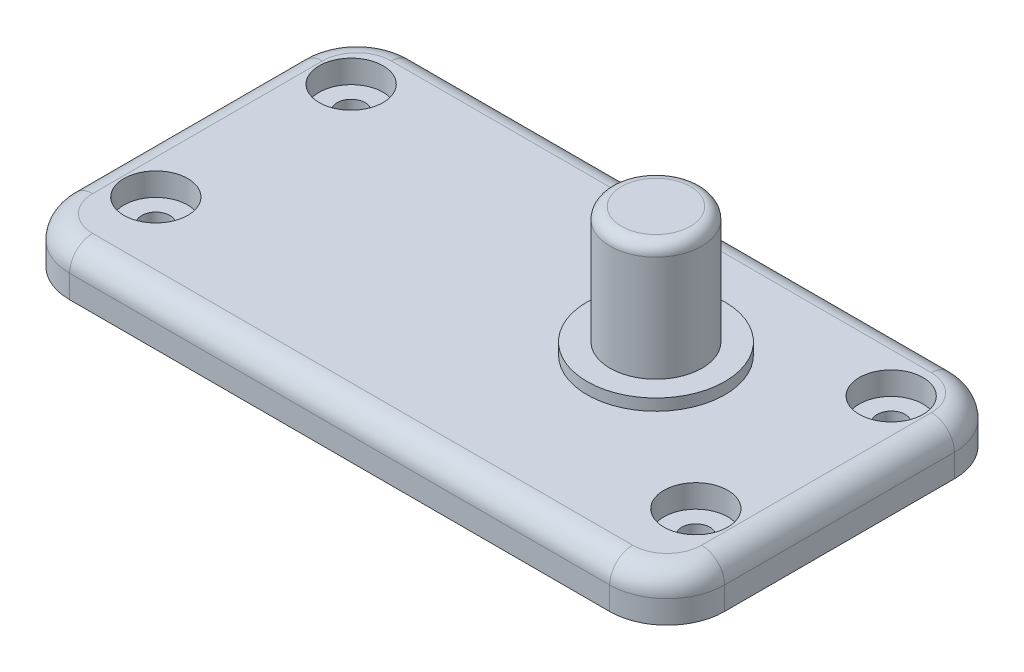
ISO-10303-21;
HEADER;
FILE_DESCRIPTION(('STEP AP214'),'2;1');
FILE_NAME('part.step','',(''),(''),'','','');
FILE_SCHEMA(('AUTOMOTIVE_DESIGN { 1 0 10303 214 1 1 1 1 }'));
ENDSEC;
DATA;
#1=APPLICATION_CONTEXT('core data for automotive mechanical design processes');
#2=APPLICATION_PROTOCOL_DEFINITION('international standard','automotive_design',2000,#1);
#3=PRODUCT_CONTEXT('',#1,'mechanical');
#4=PRODUCT('Part','Part','',(#3));
#5=PRODUCT_RELATED_PRODUCT_CATEGORY('part','',(#4));
#6=PRODUCT_DEFINITION_FORMATION('','',#4);
#7=PRODUCT_DEFINITION_CONTEXT('part definition',#1,'design');
#8=PRODUCT_DEFINITION('design','',#6,#7);
#9=PRODUCT_DEFINITION_SHAPE('','',#8);
#10=(LENGTH_UNIT() NAMED_UNIT(*) SI_UNIT(.MILLI.,.METRE.));
#11=(NAMED_UNIT(*) PLANE_ANGLE_UNIT() SI_UNIT($,.RADIAN.));
#12=(NAMED_UNIT(*) SI_UNIT($,.STERADIAN.) SOLID_ANGLE_UNIT());
#13=UNCERTAINTY_MEASURE_WITH_UNIT(LENGTH_MEASURE(1.E-05),#10,'distance_accuracy_value','');
#14=(GEOMETRIC_REPRESENTATION_CONTEXT(3) GLOBAL_UNCERTAINTY_ASSIGNED_CONTEXT((#13)) GLOBAL_UNIT_ASSIGNED_CONTEXT((#10,
#11,#12)) REPRESENTATION_CONTEXT('',''));
#15=CARTESIAN_POINT('',(0.,0.,0.));
#16=DIRECTION('',(0.,0.,1.));
#17=DIRECTION('',(1.,0.,0.));
#18=AXIS2_PLACEMENT_3D('',#15,#16,#17);
#19=CARTESIAN_POINT('',(-28.5,4.,15.));
#20=DIRECTION('',(1.,0.,0.));
#21=DIRECTION('',(0.,0.,-1.));
#22=AXIS2_PLACEMENT_3D('',#19,#20,#21);
#23=PLANE('',#22);
#24=DIRECTION('',(0.,-1.,0.));
#25=VECTOR('',#24,1.);
#26=CARTESIAN_POINT('',(-28.5,4.,10.));
#27=LINE('',#26,#25);
#28=CARTESIAN_POINT('',(-28.5,0.,10.));
#29=VERTEX_POINT('',#28);
#30=CARTESIAN_POINT('',(-28.5,2.,10.));
#31=VERTEX_POINT('',#30);
#32=EDGE_CURVE('E142',#29,#31,#27,.F.);
#33=ORIENTED_EDGE('',*,*,#32,.T.);
#34=DIRECTION('',(0.,0.,1.));
#35=VECTOR('',#34,1.);
#36=CARTESIAN_POINT('',(-28.5,2.,15.));
#37=LINE('',#36,#35);
#38=CARTESIAN_POINT('',(-28.5,2.,-10.));
#39=VERTEX_POINT('',#38);
#40=EDGE_CURVE('E205',#31,#39,#37,.F.);
#41=ORIENTED_EDGE('',*,*,#40,.T.);
#42=DIRECTION('',(0.,-1.,0.));
#43=VECTOR('',#42,1.);
#44=CARTESIAN_POINT('',(-28.5,4.,-10.));
#45=LINE('',#44,#43);
#46=CARTESIAN_POINT('',(-28.5,0.,-10.));
#47=VERTEX_POINT('',#46);
#48=EDGE_CURVE('E146',#39,#47,#45,.T.);
#49=ORIENTED_EDGE('',*,*,#48,.T.);
#50=DIRECTION('',(0.,0.,1.));
#51=VECTOR('',#50,1.);
#52=CARTESIAN_POINT('',(-28.5,0.,15.));
#53=LINE('',#52,#51);
#54=EDGE_CURVE('E153',#47,#29,#53,.T.);
#55=ORIENTED_EDGE('',*,*,#54,.T.);
#56=EDGE_LOOP('',(#33,#41,#49,#55));
#57=FACE_BOUND('',#56,.T.);
#58=ADVANCED_FACE('F34',(#57),#23,.F.);
#59=CARTESIAN_POINT('',(-28.5,4.,15.));
#60=DIRECTION('',(0.,0.,-1.));
#61=DIRECTION('',(-1.,0.,0.));
#62=AXIS2_PLACEMENT_3D('',#59,#60,#61);
#63=PLANE('',#62);
#64=DIRECTION('',(0.,-1.,0.));
#65=VECTOR('',#64,1.);
#66=CARTESIAN_POINT('',(23.5,4.,15.));
#67=LINE('',#66,#65);
#68=CARTESIAN_POINT('',(23.5,0.,15.));
#69=VERTEX_POINT('',#68);
#70=CARTESIAN_POINT('',(23.5,2.,15.));
#71=VERTEX_POINT('',#70);
#72=EDGE_CURVE('E136',#69,#71,#67,.F.);
#73=ORIENTED_EDGE('',*,*,#72,.T.);
#74=DIRECTION('',(1.,0.,0.));
#75=VECTOR('',#74,1.);
#76=CARTESIAN_POINT('',(-28.5,2.,15.));
#77=LINE('',#76,#75);
#78=CARTESIAN_POINT('',(-23.5,2.,15.));
#79=VERTEX_POINT('',#78);
#80=EDGE_CURVE('E131',#71,#79,#77,.F.);
#81=ORIENTED_EDGE('',*,*,#80,.T.);
#82=DIRECTION('',(0.,-1.,0.));
#83=VECTOR('',#82,1.);
#84=CARTESIAN_POINT('',(-23.5,4.,15.));
#85=LINE('',#84,#83);
#86=CARTESIAN_POINT('',(-23.5,0.,15.));
#87=VERTEX_POINT('',#86);
#88=EDGE_CURVE('E125',#79,#87,#85,.T.);
#89=ORIENTED_EDGE('',*,*,#88,.T.);
#90=DIRECTION('',(1.,0.,0.));
#91=VECTOR('',#90,1.);
#92=CARTESIAN_POINT('',(-28.5,0.,15.));
#93=LINE('',#92,#91);
#94=EDGE_CURVE('E129',#87,#69,#93,.T.);
#95=ORIENTED_EDGE('',*,*,#94,.T.);
#96=EDGE_LOOP('',(#73,#81,#89,#95));
#97=FACE_BOUND('',#96,.T.);
#98=ADVANCED_FACE('F127',(#97),#63,.F.);
#99=CARTESIAN_POINT('',(28.5,4.,15.));
#100=DIRECTION('',(-1.,0.,0.));
#101=DIRECTION('',(0.,0.,1.));
#102=AXIS2_PLACEMENT_3D('',#99,#100,#101);
#103=PLANE('',#102);
#104=DIRECTION('',(0.,-1.,0.));
#105=VECTOR('',#104,1.);
#106=CARTESIAN_POINT('',(28.5,4.,-10.));
#107=LINE('',#106,#105);
#108=CARTESIAN_POINT('',(28.5,0.,-10.));
#109=VERTEX_POINT('',#108);
#110=CARTESIAN_POINT('',(28.5,2.,-10.));
#111=VERTEX_POINT('',#110);
#112=EDGE_CURVE('E184',#109,#111,#107,.F.);
#113=ORIENTED_EDGE('',*,*,#112,.T.);
#114=DIRECTION('',(0.,0.,-1.));
#115=VECTOR('',#114,1.);
#116=CARTESIAN_POINT('',(28.5,2.,15.));
#117=LINE('',#116,#115);
#118=CARTESIAN_POINT('',(28.5,2.,10.));
#119=VERTEX_POINT('',#118);
#120=EDGE_CURVE('E57',#111,#119,#117,.F.);
#121=ORIENTED_EDGE('',*,*,#120,.T.);
#122=DIRECTION('',(0.,-1.,0.));
#123=VECTOR('',#122,1.);
#124=CARTESIAN_POINT('',(28.5,4.,10.));
#125=LINE('',#124,#123);
#126=CARTESIAN_POINT('',(28.5,0.,10.));
#127=VERTEX_POINT('',#126);
#128=EDGE_CURVE('E182',#119,#127,#125,.T.);
#129=ORIENTED_EDGE('',*,*,#128,.T.);
#130=DIRECTION('',(0.,0.,-1.));
#131=VECTOR('',#130,1.);
#132=CARTESIAN_POINT('',(28.5,0.,15.));
#133=LINE('',#132,#131);
#134=EDGE_CURVE('E152',#127,#109,#133,.T.);
#135=ORIENTED_EDGE('',*,*,#134,.T.);
#136=EDGE_LOOP('',(#113,#121,#129,#135));
#137=FACE_BOUND('',#136,.T.);
#138=ADVANCED_FACE('F259',(#137),#103,.F.);
#139=CARTESIAN_POINT('',(-28.5,4.,-15.));
#140=DIRECTION('',(0.,0.,1.));
#141=DIRECTION('',(1.,0.,0.));
#142=AXIS2_PLACEMENT_3D('',#139,#140,#141);
#143=PLANE('',#142);
#144=DIRECTION('',(0.,-1.,0.));
#145=VECTOR('',#144,1.);
#146=CARTESIAN_POINT('',(-23.5,4.,-15.));
#147=LINE('',#146,#145);
#148=CARTESIAN_POINT('',(-23.5,0.,-15.));
#149=VERTEX_POINT('',#148);
#150=CARTESIAN_POINT('',(-23.5,2.,-15.));
#151=VERTEX_POINT('',#150);
#152=EDGE_CURVE('E179',#149,#151,#147,.F.);
#153=ORIENTED_EDGE('',*,*,#152,.T.);
#154=DIRECTION('',(-1.,0.,0.));
#155=VECTOR('',#154,1.);
#156=CARTESIAN_POINT('',(-28.5,2.,-15.));
#157=LINE('',#156,#155);
#158=CARTESIAN_POINT('',(23.5,2.,-15.));
#159=VERTEX_POINT('',#158);
#160=EDGE_CURVE('E209',#151,#159,#157,.F.);
#161=ORIENTED_EDGE('',*,*,#160,.T.);
#162=DIRECTION('',(0.,-1.,0.));
#163=VECTOR('',#162,1.);
#164=CARTESIAN_POINT('',(23.5,4.,-15.));
#165=LINE('',#164,#163);
#166=CARTESIAN_POINT('',(23.5,0.,-15.));
#167=VERTEX_POINT('',#166);
#168=EDGE_CURVE('E177',#159,#167,#165,.T.);
#169=ORIENTED_EDGE('',*,*,#168,.T.);
#170=DIRECTION('',(-1.,0.,0.));
#171=VECTOR('',#170,1.);
#172=CARTESIAN_POINT('',(-28.5,0.,-15.));
#173=LINE('',#172,#171);
#174=EDGE_CURVE('E156',#167,#149,#173,.T.);
#175=ORIENTED_EDGE('',*,*,#174,.T.);
#176=EDGE_LOOP('',(#153,#161,#169,#175));
#177=FACE_BOUND('',#176,.T.);
#178=ADVANCED_FACE('F322',(#177),#143,.F.);
#179=CARTESIAN_POINT('',(0.,4.,0.));
#180=DIRECTION('',(0.,-1.,0.));
#181=DIRECTION('',(0.,0.,-1.));
#182=AXIS2_PLACEMENT_3D('',#179,#180,#181);
#183=PLANE('',#182);
#184=DIRECTION('',(0.,0.,1.));
#185=VECTOR('',#184,1.);
#186=CARTESIAN_POINT('',(-26.5,4.,0.));
#187=LINE('',#186,#185);
#188=CARTESIAN_POINT('',(-26.5,4.,-10.));
#189=VERTEX_POINT('',#188);
#190=CARTESIAN_POINT('',(-26.5,4.,10.));
#191=VERTEX_POINT('',#190);
#192=EDGE_CURVE('E198',#189,#191,#187,.T.);
#193=ORIENTED_EDGE('',*,*,#192,.T.);
#194=CARTESIAN_POINT('',(-23.5,4.,10.));
#195=DIRECTION('',(0.,-1.,0.));
#196=DIRECTION('',(0.,0.,-1.));
#197=AXIS2_PLACEMENT_3D('',#194,#195,#196);
#198=CIRCLE('',#197,3.);
#199=CARTESIAN_POINT('',(-23.5,4.,13.));
#200=VERTEX_POINT('',#199);
#201=EDGE_CURVE('E200',#191,#200,#198,.F.);
#202=ORIENTED_EDGE('',*,*,#201,.T.);
#203=DIRECTION('',(1.,0.,0.));
#204=VECTOR('',#203,1.);
#205=CARTESIAN_POINT('',(0.,4.,13.));
#206=LINE('',#205,#204);
#207=CARTESIAN_POINT('',(23.5,4.,13.));
#208=VERTEX_POINT('',#207);
#209=EDGE_CURVE('E186',#200,#208,#206,.T.);
#210=ORIENTED_EDGE('',*,*,#209,.T.);
#211=CARTESIAN_POINT('',(23.5,4.,10.));
#212=DIRECTION('',(0.,-1.,0.));
#213=DIRECTION('',(0.,0.,-1.));
#214=AXIS2_PLACEMENT_3D('',#211,#212,#213);
#215=CIRCLE('',#214,3.);
#216=CARTESIAN_POINT('',(26.5,4.,10.));
#217=VERTEX_POINT('',#216);
#218=EDGE_CURVE('E188',#208,#217,#215,.F.);
#219=ORIENTED_EDGE('',*,*,#218,.T.);
#220=DIRECTION('',(0.,0.,-1.));
#221=VECTOR('',#220,1.);
#222=CARTESIAN_POINT('',(26.5,4.,0.));
#223=LINE('',#222,#221);
#224=CARTESIAN_POINT('',(26.5,4.,-10.));
#225=VERTEX_POINT('',#224);
#226=EDGE_CURVE('E190',#217,#225,#223,.T.);
#227=ORIENTED_EDGE('',*,*,#226,.T.);
#228=CARTESIAN_POINT('',(23.5,4.,-10.));
#229=DIRECTION('',(0.,-1.,0.));
#230=DIRECTION('',(0.,0.,-1.));
#231=AXIS2_PLACEMENT_3D('',#228,#229,#230);
#232=CIRCLE('',#231,3.);
#233=CARTESIAN_POINT('',(23.5,4.,-13.));
#234=VERTEX_POINT('',#233);
#235=EDGE_CURVE('E192',#225,#234,#232,.F.);
#236=ORIENTED_EDGE('',*,*,#235,.T.);
#237=DIRECTION('',(-1.,0.,0.));
#238=VECTOR('',#237,1.);
#239=CARTESIAN_POINT('',(0.,4.,-13.));
#240=LINE('',#239,#238);
#241=CARTESIAN_POINT('',(-23.5,4.,-13.));
#242=VERTEX_POINT('',#241);
#243=EDGE_CURVE('E194',#234,#242,#240,.T.);
#244=ORIENTED_EDGE('',*,*,#243,.T.);
#245=CARTESIAN_POINT('',(-23.5,4.,-10.));
#246=DIRECTION('',(0.,-1.,0.));
#247=DIRECTION('',(0.,0.,-1.));
#248=AXIS2_PLACEMENT_3D('',#245,#246,#247);
#249=CIRCLE('',#248,3.);
#250=EDGE_CURVE('E196',#242,#189,#249,.F.);
#251=ORIENTED_EDGE('',*,*,#250,.T.);
#252=EDGE_LOOP('',(#193,#202,#210,#219,#227,#236,#244,#251));
#253=FACE_BOUND('',#252,.T.);
#254=CARTESIAN_POINT('',(-23.5,4.,-9.49999999999999));
#255=DIRECTION('',(0.,1.,0.));
#256=DIRECTION('',(0.,0.,1.));
#257=AXIS2_PLACEMENT_3D('',#254,#255,#256);
#258=CIRCLE('',#257,2.77875999999999);
#259=CARTESIAN_POINT('',(-23.5,4.,-6.72124));
#260=VERTEX_POINT('',#259);
#261=EDGE_CURVE('E237',#260,#260,#258,.T.);
#262=ORIENTED_EDGE('',*,*,#261,.F.);
#263=EDGE_LOOP('',(#262));
#264=FACE_BOUND('',#263,.T.);
#265=CARTESIAN_POINT('',(-23.5,4.,7.50000000000001));
#266=DIRECTION('',(0.,1.,0.));
#267=DIRECTION('',(0.,0.,1.));
#268=AXIS2_PLACEMENT_3D('',#265,#266,#267);
#269=CIRCLE('',#268,2.77875999999999);
#270=CARTESIAN_POINT('',(-23.5,4.,10.27876));
#271=VERTEX_POINT('',#270);
#272=EDGE_CURVE('E424',#271,#271,#269,.T.);
#273=ORIENTED_EDGE('',*,*,#272,.F.);
#274=EDGE_LOOP('',(#273));
#275=FACE_BOUND('',#274,.T.);
#276=CARTESIAN_POINT('',(23.5,4.,7.50000000000001));
#277=DIRECTION('',(0.,1.,0.));
#278=DIRECTION('',(0.,0.,1.));
#279=AXIS2_PLACEMENT_3D('',#276,#277,#278);
#280=CIRCLE('',#279,2.77875999999999);
#281=CARTESIAN_POINT('',(23.5,4.,10.27876));
#282=VERTEX_POINT('',#281);
#283=EDGE_CURVE('E436',#282,#282,#280,.T.);
#284=ORIENTED_EDGE('',*,*,#283,.F.);
#285=EDGE_LOOP('',(#284));
#286=FACE_BOUND('',#285,.T.);
#287=CARTESIAN_POINT('',(23.5,4.,-9.49999999999999));
#288=DIRECTION('',(0.,1.,0.));
#289=DIRECTION('',(0.,0.,1.));
#290=AXIS2_PLACEMENT_3D('',#287,#288,#289);
#291=CIRCLE('',#290,2.77875999999999);
#292=CARTESIAN_POINT('',(23.5,4.,-6.72124));
#293=VERTEX_POINT('',#292);
#294=EDGE_CURVE('E448',#293,#293,#291,.T.);
#295=ORIENTED_EDGE('',*,*,#294,.F.);
#296=EDGE_LOOP('',(#295));
#297=FACE_BOUND('',#296,.T.);
#298=CARTESIAN_POINT('',(10.18,4.,-2.35));
#299=DIRECTION('',(0.,-1.,0.));
#300=DIRECTION('',(0.,0.,-1.));
#301=AXIS2_PLACEMENT_3D('',#298,#299,#300);
#302=CIRCLE('',#301,5.99999999999999);
#303=CARTESIAN_POINT('',(10.18,4.,-8.34999999999999));
#304=VERTEX_POINT('',#303);
#305=EDGE_CURVE('E164',#304,#304,#302,.F.);
#306=ORIENTED_EDGE('',*,*,#305,.F.);
#307=EDGE_LOOP('',(#306));
#308=FACE_BOUND('',#307,.T.);
#309=ADVANCED_FACE('F332',(#253,#264,#275,#286,#297,#308),#183,.F.);
#310=CARTESIAN_POINT('',(0.,0.,0.));
#311=DIRECTION('',(0.,-1.,0.));
#312=DIRECTION('',(0.,0.,-1.));
#313=AXIS2_PLACEMENT_3D('',#310,#311,#312);
#314=PLANE('',#313);
#315=CARTESIAN_POINT('',(-23.5,0.,-9.49999999999999));
#316=DIRECTION('',(0.,1.,0.));
#317=DIRECTION('',(0.,0.,1.));
#318=AXIS2_PLACEMENT_3D('',#315,#316,#317);
#319=CIRCLE('',#318,1.2192);
#320=CARTESIAN_POINT('',(-23.5,0.,-8.28079999999999));
#321=VERTEX_POINT('',#320);
#322=EDGE_CURVE('E421',#321,#321,#319,.T.);
#323=ORIENTED_EDGE('',*,*,#322,.T.);
#324=EDGE_LOOP('',(#323));
#325=FACE_BOUND('',#324,.T.);
#326=CARTESIAN_POINT('',(-23.5,0.,7.50000000000001));
#327=DIRECTION('',(0.,1.,0.));
#328=DIRECTION('',(0.,0.,1.));
#329=AXIS2_PLACEMENT_3D('',#326,#327,#328);
#330=CIRCLE('',#329,1.2192);
#331=CARTESIAN_POINT('',(-23.5,0.,8.71920000000001));
#332=VERTEX_POINT('',#331);
#333=EDGE_CURVE('E433',#332,#332,#330,.T.);
#334=ORIENTED_EDGE('',*,*,#333,.T.);
#335=EDGE_LOOP('',(#334));
#336=FACE_BOUND('',#335,.T.);
#337=CARTESIAN_POINT('',(23.5,0.,7.50000000000001));
#338=DIRECTION('',(0.,1.,0.));
#339=DIRECTION('',(0.,0.,1.));
#340=AXIS2_PLACEMENT_3D('',#337,#338,#339);
#341=CIRCLE('',#340,1.2192);
#342=CARTESIAN_POINT('',(23.5,0.,8.71920000000001));
#343=VERTEX_POINT('',#342);
#344=EDGE_CURVE('E445',#343,#343,#341,.T.);
#345=ORIENTED_EDGE('',*,*,#344,.T.);
#346=EDGE_LOOP('',(#345));
#347=FACE_BOUND('',#346,.T.);
#348=CARTESIAN_POINT('',(23.5,0.,-9.49999999999999));
#349=DIRECTION('',(0.,1.,0.));
#350=DIRECTION('',(0.,0.,1.));
#351=AXIS2_PLACEMENT_3D('',#348,#349,#350);
#352=CIRCLE('',#351,1.2192);
#353=CARTESIAN_POINT('',(23.5,0.,-8.28079999999999));
#354=VERTEX_POINT('',#353);
#355=EDGE_CURVE('E457',#354,#354,#352,.T.);
#356=ORIENTED_EDGE('',*,*,#355,.T.);
#357=EDGE_LOOP('',(#356));
#358=FACE_BOUND('',#357,.T.);
#359=ORIENTED_EDGE('',*,*,#94,.F.);
#360=CARTESIAN_POINT('',(-23.5,0.,10.));
#361=DIRECTION('',(0.,-1.,0.));
#362=DIRECTION('',(0.,0.,-1.));
#363=AXIS2_PLACEMENT_3D('',#360,#361,#362);
#364=CIRCLE('',#363,5.);
#365=EDGE_CURVE('E139',#87,#29,#364,.T.);
#366=ORIENTED_EDGE('',*,*,#365,.T.);
#367=ORIENTED_EDGE('',*,*,#54,.F.);
#368=CARTESIAN_POINT('',(-23.5,0.,-10.));
#369=DIRECTION('',(0.,-1.,0.));
#370=DIRECTION('',(0.,0.,-1.));
#371=AXIS2_PLACEMENT_3D('',#368,#369,#370);
#372=CIRCLE('',#371,5.);
#373=EDGE_CURVE('E147',#47,#149,#372,.T.);
#374=ORIENTED_EDGE('',*,*,#373,.T.);
#375=ORIENTED_EDGE('',*,*,#174,.F.);
#376=CARTESIAN_POINT('',(23.5,0.,-10.));
#377=DIRECTION('',(0.,-1.,0.));
#378=DIRECTION('',(0.,0.,-1.));
#379=AXIS2_PLACEMENT_3D('',#376,#377,#378);
#380=CIRCLE('',#379,5.);
#381=EDGE_CURVE('E172',#167,#109,#380,.T.);
#382=ORIENTED_EDGE('',*,*,#381,.T.);
#383=ORIENTED_EDGE('',*,*,#134,.F.);
#384=CARTESIAN_POINT('',(23.5,0.,10.));
#385=DIRECTION('',(0.,-1.,0.));
#386=DIRECTION('',(0.,0.,-1.));
#387=AXIS2_PLACEMENT_3D('',#384,#385,#386);
#388=CIRCLE('',#387,5.);
#389=EDGE_CURVE('E135',#127,#69,#388,.T.);
#390=ORIENTED_EDGE('',*,*,#389,.T.);
#391=EDGE_LOOP('',(#359,#366,#367,#374,#375,#382,#383,#390));
#392=FACE_BOUND('',#391,.T.);
#393=ADVANCED_FACE('F149',(#325,#336,#347,#358,#392),#314,.T.);
#394=CARTESIAN_POINT('',(10.18,5.,-2.35));
#395=DIRECTION('',(0.,-1.,0.));
#396=DIRECTION('',(0.,0.,-1.));
#397=AXIS2_PLACEMENT_3D('',#394,#395,#396);
#398=CYLINDRICAL_SURFACE('',#397,5.99999999999999);
#399=CARTESIAN_POINT('',(10.18,5.,-2.35));
#400=DIRECTION('',(0.,1.,0.));
#401=DIRECTION('',(0.,0.,1.));
#402=AXIS2_PLACEMENT_3D('',#399,#400,#401);
#403=CIRCLE('',#402,5.99999999999999);
#404=CARTESIAN_POINT('',(10.18,5.,3.65));
#405=VERTEX_POINT('',#404);
#406=EDGE_CURVE('E167',#405,#405,#403,.T.);
#407=ORIENTED_EDGE('',*,*,#406,.F.);
#408=EDGE_LOOP('',(#407));
#409=FACE_BOUND('',#408,.T.);
#410=ORIENTED_EDGE('',*,*,#305,.T.);
#411=EDGE_LOOP('',(#410));
#412=FACE_BOUND('',#411,.T.);
#413=ADVANCED_FACE('F344',(#409,#412),#398,.T.);
#414=CARTESIAN_POINT('',(10.18,5.,-2.35));
#415=DIRECTION('',(0.,1.,0.));
#416=DIRECTION('',(0.,0.,1.));
#417=AXIS2_PLACEMENT_3D('',#414,#415,#416);
#418=PLANE('',#417);
#419=CARTESIAN_POINT('',(10.18,5.,-2.35));
#420=DIRECTION('',(0.,1.,0.));
#421=DIRECTION('',(0.,0.,1.));
#422=AXIS2_PLACEMENT_3D('',#419,#420,#421);
#423=CIRCLE('',#422,3.99999999999999);
#424=CARTESIAN_POINT('',(10.18,5.,1.64999999999999));
#425=VERTEX_POINT('',#424);
#426=EDGE_CURVE('E158',#425,#425,#423,.T.);
#427=ORIENTED_EDGE('',*,*,#426,.F.);
#428=EDGE_LOOP('',(#427));
#429=FACE_BOUND('',#428,.T.);
#430=ORIENTED_EDGE('',*,*,#406,.T.);
#431=EDGE_LOOP('',(#430));
#432=FACE_BOUND('',#431,.T.);
#433=ADVANCED_FACE('F355',(#429,#432),#418,.T.);
#434=CARTESIAN_POINT('',(10.18,15.2,-2.35));
#435=DIRECTION('',(0.,1.,0.));
#436=DIRECTION('',(0.,0.,1.));
#437=AXIS2_PLACEMENT_3D('',#434,#435,#436);
#438=PLANE('',#437);
#439=CARTESIAN_POINT('',(10.18,15.2,-2.35));
#440=DIRECTION('',(0.,1.,0.));
#441=DIRECTION('',(0.,0.,1.));
#442=AXIS2_PLACEMENT_3D('',#439,#440,#441);
#443=CIRCLE('',#442,2.99999999999999);
#444=CARTESIAN_POINT('',(10.18,15.2,0.649999999999995));
#445=VERTEX_POINT('',#444);
#446=EDGE_CURVE('E42',#445,#445,#443,.T.);
#447=ORIENTED_EDGE('',*,*,#446,.T.);
#448=EDGE_LOOP('',(#447));
#449=FACE_BOUND('',#448,.T.);
#450=ADVANCED_FACE('F241',(#449),#438,.T.);
#451=CARTESIAN_POINT('',(10.18,15.2,-2.35));
#452=DIRECTION('',(0.,-1.,0.));
#453=DIRECTION('',(0.,0.,-1.));
#454=AXIS2_PLACEMENT_3D('',#451,#452,#453);
#455=CYLINDRICAL_SURFACE('',#454,3.99999999999999);
#456=CARTESIAN_POINT('',(10.18,14.2,-2.35));
#457=DIRECTION('',(0.,1.,0.));
#458=DIRECTION('',(0.,0.,1.));
#459=AXIS2_PLACEMENT_3D('',#456,#457,#458);
#460=CIRCLE('',#459,3.99999999999999);
#461=CARTESIAN_POINT('',(10.18,14.2,1.64999999999999));
#462=VERTEX_POINT('',#461);
#463=EDGE_CURVE('E11',#462,#462,#460,.F.);
#464=ORIENTED_EDGE('',*,*,#463,.T.);
#465=EDGE_LOOP('',(#464));
#466=FACE_BOUND('',#465,.T.);
#467=ORIENTED_EDGE('',*,*,#426,.T.);
#468=EDGE_LOOP('',(#467));
#469=FACE_BOUND('',#468,.T.);
#470=ADVANCED_FACE('F348',(#466,#469),#455,.T.);
#471=CARTESIAN_POINT('',(23.5,4.,-9.49999999999999));
#472=DIRECTION('',(0.,1.,0.));
#473=DIRECTION('',(0.,0.,1.));
#474=AXIS2_PLACEMENT_3D('',#471,#472,#473);
#475=CYLINDRICAL_SURFACE('',#474,1.2192);
#476=ORIENTED_EDGE('',*,*,#355,.F.);
#477=EDGE_LOOP('',(#476));
#478=FACE_BOUND('',#477,.T.);
#479=CARTESIAN_POINT('',(23.5,1.999999936,-9.49999999999999));
#480=DIRECTION('',(0.,1.,0.));
#481=DIRECTION('',(0.,0.,1.));
#482=AXIS2_PLACEMENT_3D('',#479,#480,#481);
#483=CIRCLE('',#482,1.2192);
#484=CARTESIAN_POINT('',(23.5,1.999999936,-8.28079999999999));
#485=VERTEX_POINT('',#484);
#486=EDGE_CURVE('E454',#485,#485,#483,.T.);
#487=ORIENTED_EDGE('',*,*,#486,.T.);
#488=EDGE_LOOP('',(#487));
#489=FACE_BOUND('',#488,.T.);
#490=ADVANCED_FACE('F351',(#478,#489),#475,.F.);
#491=CARTESIAN_POINT('',(24.7192,1.999999936,-9.49999999999999));
#492=DIRECTION('',(0.,-1.,0.));
#493=DIRECTION('',(0.,0.,-1.));
#494=AXIS2_PLACEMENT_3D('',#491,#492,#493);
#495=PLANE('',#494);
#496=ORIENTED_EDGE('',*,*,#486,.F.);
#497=EDGE_LOOP('',(#496));
#498=FACE_BOUND('',#497,.T.);
#499=CARTESIAN_POINT('',(23.5,1.999999936,-9.49999999999999));
#500=DIRECTION('',(0.,1.,0.));
#501=DIRECTION('',(0.,0.,1.));
#502=AXIS2_PLACEMENT_3D('',#499,#500,#501);
#503=CIRCLE('',#502,2.77876);
#504=CARTESIAN_POINT('',(23.5,1.999999936,-6.72124));
#505=VERTEX_POINT('',#504);
#506=EDGE_CURVE('E451',#505,#505,#503,.T.);
#507=ORIENTED_EDGE('',*,*,#506,.T.);
#508=EDGE_LOOP('',(#507));
#509=FACE_BOUND('',#508,.T.);
#510=ADVANCED_FACE('F364',(#498,#509),#495,.F.);
#511=CARTESIAN_POINT('',(23.5,4.,-9.49999999999999));
#512=DIRECTION('',(0.,1.,0.));
#513=DIRECTION('',(0.,0.,1.));
#514=AXIS2_PLACEMENT_3D('',#511,#512,#513);
#515=CYLINDRICAL_SURFACE('',#514,2.77876);
#516=ORIENTED_EDGE('',*,*,#506,.F.);
#517=EDGE_LOOP('',(#516));
#518=FACE_BOUND('',#517,.T.);
#519=ORIENTED_EDGE('',*,*,#294,.T.);
#520=EDGE_LOOP('',(#519));
#521=FACE_BOUND('',#520,.T.);
#522=ADVANCED_FACE('F368',(#518,#521),#515,.F.);
#523=CARTESIAN_POINT('',(23.5,4.,7.50000000000001));
#524=DIRECTION('',(0.,1.,0.));
#525=DIRECTION('',(0.,0.,1.));
#526=AXIS2_PLACEMENT_3D('',#523,#524,#525);
#527=CYLINDRICAL_SURFACE('',#526,1.2192);
#528=ORIENTED_EDGE('',*,*,#344,.F.);
#529=EDGE_LOOP('',(#528));
#530=FACE_BOUND('',#529,.T.);
#531=CARTESIAN_POINT('',(23.5,1.999999936,7.50000000000001));
#532=DIRECTION('',(0.,1.,0.));
#533=DIRECTION('',(0.,0.,1.));
#534=AXIS2_PLACEMENT_3D('',#531,#532,#533);
#535=CIRCLE('',#534,1.2192);
#536=CARTESIAN_POINT('',(23.5,1.999999936,8.71920000000001));
#537=VERTEX_POINT('',#536);
#538=EDGE_CURVE('E442',#537,#537,#535,.T.);
#539=ORIENTED_EDGE('',*,*,#538,.T.);
#540=EDGE_LOOP('',(#539));
#541=FACE_BOUND('',#540,.T.);
#542=ADVANCED_FACE('F372',(#530,#541),#527,.F.);
#543=CARTESIAN_POINT('',(24.7192,1.999999936,7.50000000000001));
#544=DIRECTION('',(0.,-1.,0.));
#545=DIRECTION('',(0.,0.,-1.));
#546=AXIS2_PLACEMENT_3D('',#543,#544,#545);
#547=PLANE('',#546);
#548=ORIENTED_EDGE('',*,*,#538,.F.);
#549=EDGE_LOOP('',(#548));
#550=FACE_BOUND('',#549,.T.);
#551=CARTESIAN_POINT('',(23.5,1.999999936,7.50000000000001));
#552=DIRECTION('',(0.,1.,0.));
#553=DIRECTION('',(0.,0.,1.));
#554=AXIS2_PLACEMENT_3D('',#551,#552,#553);
#555=CIRCLE('',#554,2.77876);
#556=CARTESIAN_POINT('',(23.5,1.999999936,10.27876));
#557=VERTEX_POINT('',#556);
#558=EDGE_CURVE('E439',#557,#557,#555,.T.);
#559=ORIENTED_EDGE('',*,*,#558,.T.);
#560=EDGE_LOOP('',(#559));
#561=FACE_BOUND('',#560,.T.);
#562=ADVANCED_FACE('F376',(#550,#561),#547,.F.);
#563=CARTESIAN_POINT('',(23.5,4.,7.50000000000001));
#564=DIRECTION('',(0.,1.,0.));
#565=DIRECTION('',(0.,0.,1.));
#566=AXIS2_PLACEMENT_3D('',#563,#564,#565);
#567=CYLINDRICAL_SURFACE('',#566,2.77876);
#568=ORIENTED_EDGE('',*,*,#558,.F.);
#569=EDGE_LOOP('',(#568));
#570=FACE_BOUND('',#569,.T.);
#571=ORIENTED_EDGE('',*,*,#283,.T.);
#572=EDGE_LOOP('',(#571));
#573=FACE_BOUND('',#572,.T.);
#574=ADVANCED_FACE('F380',(#570,#573),#567,.F.);
#575=CARTESIAN_POINT('',(-23.5,4.,7.50000000000001));
#576=DIRECTION('',(0.,1.,0.));
#577=DIRECTION('',(0.,0.,1.));
#578=AXIS2_PLACEMENT_3D('',#575,#576,#577);
#579=CYLINDRICAL_SURFACE('',#578,1.2192);
#580=ORIENTED_EDGE('',*,*,#333,.F.);
#581=EDGE_LOOP('',(#580));
#582=FACE_BOUND('',#581,.T.);
#583=CARTESIAN_POINT('',(-23.5,1.999999936,7.50000000000001));
#584=DIRECTION('',(0.,1.,0.));
#585=DIRECTION('',(0.,0.,1.));
#586=AXIS2_PLACEMENT_3D('',#583,#584,#585);
#587=CIRCLE('',#586,1.2192);
#588=CARTESIAN_POINT('',(-23.5,1.999999936,8.71920000000001));
#589=VERTEX_POINT('',#588);
#590=EDGE_CURVE('E430',#589,#589,#587,.T.);
#591=ORIENTED_EDGE('',*,*,#590,.T.);
#592=EDGE_LOOP('',(#591));
#593=FACE_BOUND('',#592,.T.);
#594=ADVANCED_FACE('F384',(#582,#593),#579,.F.);
#595=CARTESIAN_POINT('',(-22.2808,1.999999936,7.50000000000001));
#596=DIRECTION('',(0.,-1.,0.));
#597=DIRECTION('',(0.,0.,-1.));
#598=AXIS2_PLACEMENT_3D('',#595,#596,#597);
#599=PLANE('',#598);
#600=ORIENTED_EDGE('',*,*,#590,.F.);
#601=EDGE_LOOP('',(#600));
#602=FACE_BOUND('',#601,.T.);
#603=CARTESIAN_POINT('',(-23.5,1.999999936,7.50000000000001));
#604=DIRECTION('',(0.,1.,0.));
#605=DIRECTION('',(0.,0.,1.));
#606=AXIS2_PLACEMENT_3D('',#603,#604,#605);
#607=CIRCLE('',#606,2.77876);
#608=CARTESIAN_POINT('',(-23.5,1.999999936,10.27876));
#609=VERTEX_POINT('',#608);
#610=EDGE_CURVE('E427',#609,#609,#607,.T.);
#611=ORIENTED_EDGE('',*,*,#610,.T.);
#612=EDGE_LOOP('',(#611));
#613=FACE_BOUND('',#612,.T.);
#614=ADVANCED_FACE('F388',(#602,#613),#599,.F.);
#615=CARTESIAN_POINT('',(-23.5,4.,7.50000000000001));
#616=DIRECTION('',(0.,1.,0.));
#617=DIRECTION('',(0.,0.,1.));
#618=AXIS2_PLACEMENT_3D('',#615,#616,#617);
#619=CYLINDRICAL_SURFACE('',#618,2.77876);
#620=ORIENTED_EDGE('',*,*,#610,.F.);
#621=EDGE_LOOP('',(#620));
#622=FACE_BOUND('',#621,.T.);
#623=ORIENTED_EDGE('',*,*,#272,.T.);
#624=EDGE_LOOP('',(#623));
#625=FACE_BOUND('',#624,.T.);
#626=ADVANCED_FACE('F392',(#622,#625),#619,.F.);
#627=CARTESIAN_POINT('',(-23.5,4.,-9.49999999999999));
#628=DIRECTION('',(0.,1.,0.));
#629=DIRECTION('',(0.,0.,1.));
#630=AXIS2_PLACEMENT_3D('',#627,#628,#629);
#631=CYLINDRICAL_SURFACE('',#630,1.2192);
#632=ORIENTED_EDGE('',*,*,#322,.F.);
#633=EDGE_LOOP('',(#632));
#634=FACE_BOUND('',#633,.T.);
#635=CARTESIAN_POINT('',(-23.5,1.999999936,-9.49999999999999));
#636=DIRECTION('',(0.,1.,0.));
#637=DIRECTION('',(0.,0.,1.));
#638=AXIS2_PLACEMENT_3D('',#635,#636,#637);
#639=CIRCLE('',#638,1.2192);
#640=CARTESIAN_POINT('',(-23.5,1.999999936,-8.28079999999999));
#641=VERTEX_POINT('',#640);
#642=EDGE_CURVE('E416',#641,#641,#639,.T.);
#643=ORIENTED_EDGE('',*,*,#642,.T.);
#644=EDGE_LOOP('',(#643));
#645=FACE_BOUND('',#644,.T.);
#646=ADVANCED_FACE('F396',(#634,#645),#631,.F.);
#647=CARTESIAN_POINT('',(-22.2808,1.999999936,-9.49999999999999));
#648=DIRECTION('',(0.,-1.,0.));
#649=DIRECTION('',(0.,0.,-1.));
#650=AXIS2_PLACEMENT_3D('',#647,#648,#649);
#651=PLANE('',#650);
#652=ORIENTED_EDGE('',*,*,#642,.F.);
#653=EDGE_LOOP('',(#652));
#654=FACE_BOUND('',#653,.T.);
#655=CARTESIAN_POINT('',(-23.5,1.999999936,-9.49999999999999));
#656=DIRECTION('',(0.,1.,0.));
#657=DIRECTION('',(0.,0.,1.));
#658=AXIS2_PLACEMENT_3D('',#655,#656,#657);
#659=CIRCLE('',#658,2.77876);
#660=CARTESIAN_POINT('',(-23.5,1.999999936,-6.72124));
#661=VERTEX_POINT('',#660);
#662=EDGE_CURVE('E412',#661,#661,#659,.T.);
#663=ORIENTED_EDGE('',*,*,#662,.T.);
#664=EDGE_LOOP('',(#663));
#665=FACE_BOUND('',#664,.T.);
#666=ADVANCED_FACE('F400',(#654,#665),#651,.F.);
#667=CARTESIAN_POINT('',(-23.5,4.,-9.49999999999999));
#668=DIRECTION('',(0.,1.,0.));
#669=DIRECTION('',(0.,0.,1.));
#670=AXIS2_PLACEMENT_3D('',#667,#668,#669);
#671=CYLINDRICAL_SURFACE('',#670,2.77876);
#672=ORIENTED_EDGE('',*,*,#662,.F.);
#673=EDGE_LOOP('',(#672));
#674=FACE_BOUND('',#673,.T.);
#675=ORIENTED_EDGE('',*,*,#261,.T.);
#676=EDGE_LOOP('',(#675));
#677=FACE_BOUND('',#676,.T.);
#678=ADVANCED_FACE('F266',(#674,#677),#671,.F.);
#679=CARTESIAN_POINT('',(-23.5,4.,10.));
#680=DIRECTION('',(0.,-1.,0.));
#681=DIRECTION('',(0.,0.,-1.));
#682=AXIS2_PLACEMENT_3D('',#679,#680,#681);
#683=CYLINDRICAL_SURFACE('',#682,5.);
#684=ORIENTED_EDGE('',*,*,#88,.F.);
#685=CARTESIAN_POINT('',(-23.5,2.,10.));
#686=DIRECTION('',(0.,-1.,0.));
#687=DIRECTION('',(0.,0.,-1.));
#688=AXIS2_PLACEMENT_3D('',#685,#686,#687);
#689=CIRCLE('',#688,5.);
#690=EDGE_CURVE('E203',#79,#31,#689,.T.);
#691=ORIENTED_EDGE('',*,*,#690,.T.);
#692=ORIENTED_EDGE('',*,*,#32,.F.);
#693=ORIENTED_EDGE('',*,*,#365,.F.);
#694=EDGE_LOOP('',(#684,#691,#692,#693));
#695=FACE_BOUND('',#694,.T.);
#696=ADVANCED_FACE('F140',(#695),#683,.T.);
#697=CARTESIAN_POINT('',(-23.5,4.,-10.));
#698=DIRECTION('',(0.,-1.,0.));
#699=DIRECTION('',(0.,0.,-1.));
#700=AXIS2_PLACEMENT_3D('',#697,#698,#699);
#701=CYLINDRICAL_SURFACE('',#700,5.);
#702=ORIENTED_EDGE('',*,*,#48,.F.);
#703=CARTESIAN_POINT('',(-23.5,2.,-10.));
#704=DIRECTION('',(0.,-1.,0.));
#705=DIRECTION('',(0.,0.,-1.));
#706=AXIS2_PLACEMENT_3D('',#703,#704,#705);
#707=CIRCLE('',#706,5.);
#708=EDGE_CURVE('E207',#39,#151,#707,.T.);
#709=ORIENTED_EDGE('',*,*,#708,.T.);
#710=ORIENTED_EDGE('',*,*,#152,.F.);
#711=ORIENTED_EDGE('',*,*,#373,.F.);
#712=EDGE_LOOP('',(#702,#709,#710,#711));
#713=FACE_BOUND('',#712,.T.);
#714=ADVANCED_FACE('F265',(#713),#701,.T.);
#715=CARTESIAN_POINT('',(23.5,4.,-10.));
#716=DIRECTION('',(0.,-1.,0.));
#717=DIRECTION('',(0.,0.,-1.));
#718=AXIS2_PLACEMENT_3D('',#715,#716,#717);
#719=CYLINDRICAL_SURFACE('',#718,5.);
#720=ORIENTED_EDGE('',*,*,#168,.F.);
#721=CARTESIAN_POINT('',(23.5,2.,-10.));
#722=DIRECTION('',(0.,-1.,0.));
#723=DIRECTION('',(0.,0.,-1.));
#724=AXIS2_PLACEMENT_3D('',#721,#722,#723);
#725=CIRCLE('',#724,5.);
#726=EDGE_CURVE('E211',#159,#111,#725,.T.);
#727=ORIENTED_EDGE('',*,*,#726,.T.);
#728=ORIENTED_EDGE('',*,*,#112,.F.);
#729=ORIENTED_EDGE('',*,*,#381,.F.);
#730=EDGE_LOOP('',(#720,#727,#728,#729));
#731=FACE_BOUND('',#730,.T.);
#732=ADVANCED_FACE('F269',(#731),#719,.T.);
#733=CARTESIAN_POINT('',(23.5,4.,10.));
#734=DIRECTION('',(0.,-1.,0.));
#735=DIRECTION('',(0.,0.,-1.));
#736=AXIS2_PLACEMENT_3D('',#733,#734,#735);
#737=CYLINDRICAL_SURFACE('',#736,5.);
#738=ORIENTED_EDGE('',*,*,#128,.F.);
#739=CARTESIAN_POINT('',(23.5,2.,10.));
#740=DIRECTION('',(0.,-1.,0.));
#741=DIRECTION('',(0.,0.,-1.));
#742=AXIS2_PLACEMENT_3D('',#739,#740,#741);
#743=CIRCLE('',#742,5.);
#744=EDGE_CURVE('E49',#119,#71,#743,.T.);
#745=ORIENTED_EDGE('',*,*,#744,.T.);
#746=ORIENTED_EDGE('',*,*,#72,.F.);
#747=ORIENTED_EDGE('',*,*,#389,.F.);
#748=EDGE_LOOP('',(#738,#745,#746,#747));
#749=FACE_BOUND('',#748,.T.);
#750=ADVANCED_FACE('F273',(#749),#737,.T.);
#751=CARTESIAN_POINT('',(23.5,2.,-10.));
#752=DIRECTION('',(0.,-1.,0.));
#753=DIRECTION('',(0.,0.,-1.));
#754=AXIS2_PLACEMENT_3D('',#751,#752,#753);
#755=TOROIDAL_SURFACE('',#754,3.,2.);
#756=CARTESIAN_POINT('',(26.5,2.,-10.));
#757=DIRECTION('',(0.,0.,1.));
#758=DIRECTION('',(1.,0.,0.));
#759=AXIS2_PLACEMENT_3D('',#756,#757,#758);
#760=CIRCLE('',#759,2.);
#761=EDGE_CURVE('E232',#111,#225,#760,.T.);
#762=ORIENTED_EDGE('',*,*,#761,.F.);
#763=ORIENTED_EDGE('',*,*,#726,.F.);
#764=CARTESIAN_POINT('',(23.5,2.,-13.));
#765=DIRECTION('',(-1.,0.,0.));
#766=DIRECTION('',(0.,0.,1.));
#767=AXIS2_PLACEMENT_3D('',#764,#765,#766);
#768=CIRCLE('',#767,2.);
#769=EDGE_CURVE('E235',#234,#159,#768,.T.);
#770=ORIENTED_EDGE('',*,*,#769,.F.);
#771=ORIENTED_EDGE('',*,*,#235,.F.);
#772=EDGE_LOOP('',(#762,#763,#770,#771));
#773=FACE_BOUND('',#772,.T.);
#774=ADVANCED_FACE('F276',(#773),#755,.T.);
#775=CARTESIAN_POINT('',(0.,2.,-13.));
#776=DIRECTION('',(-1.,0.,0.));
#777=DIRECTION('',(0.,0.,1.));
#778=AXIS2_PLACEMENT_3D('',#775,#776,#777);
#779=CYLINDRICAL_SURFACE('',#778,2.);
#780=ORIENTED_EDGE('',*,*,#769,.T.);
#781=ORIENTED_EDGE('',*,*,#160,.F.);
#782=CARTESIAN_POINT('',(-23.5,2.,-13.));
#783=DIRECTION('',(-1.,0.,0.));
#784=DIRECTION('',(0.,0.,1.));
#785=AXIS2_PLACEMENT_3D('',#782,#783,#784);
#786=CIRCLE('',#785,2.);
#787=EDGE_CURVE('E229',#242,#151,#786,.T.);
#788=ORIENTED_EDGE('',*,*,#787,.F.);
#789=ORIENTED_EDGE('',*,*,#243,.F.);
#790=EDGE_LOOP('',(#780,#781,#788,#789));
#791=FACE_BOUND('',#790,.T.);
#792=ADVANCED_FACE('F296',(#791),#779,.T.);
#793=CARTESIAN_POINT('',(26.5,2.,0.));
#794=DIRECTION('',(0.,0.,-1.));
#795=DIRECTION('',(-1.,0.,0.));
#796=AXIS2_PLACEMENT_3D('',#793,#794,#795);
#797=CYLINDRICAL_SURFACE('',#796,2.);
#798=ORIENTED_EDGE('',*,*,#761,.T.);
#799=ORIENTED_EDGE('',*,*,#226,.F.);
#800=CARTESIAN_POINT('',(26.5,2.,10.));
#801=DIRECTION('',(0.,0.,1.));
#802=DIRECTION('',(1.,0.,0.));
#803=AXIS2_PLACEMENT_3D('',#800,#801,#802);
#804=CIRCLE('',#803,2.);
#805=EDGE_CURVE('E226',#119,#217,#804,.T.);
#806=ORIENTED_EDGE('',*,*,#805,.F.);
#807=ORIENTED_EDGE('',*,*,#120,.F.);
#808=EDGE_LOOP('',(#798,#799,#806,#807));
#809=FACE_BOUND('',#808,.T.);
#810=ADVANCED_FACE('F292',(#809),#797,.T.);
#811=CARTESIAN_POINT('',(-23.5,2.,-10.));
#812=DIRECTION('',(0.,-1.,0.));
#813=DIRECTION('',(0.,0.,-1.));
#814=AXIS2_PLACEMENT_3D('',#811,#812,#813);
#815=TOROIDAL_SURFACE('',#814,3.,2.);
#816=ORIENTED_EDGE('',*,*,#787,.T.);
#817=ORIENTED_EDGE('',*,*,#708,.F.);
#818=CARTESIAN_POINT('',(-26.5,2.,-10.));
#819=DIRECTION('',(0.,0.,1.));
#820=DIRECTION('',(1.,0.,0.));
#821=AXIS2_PLACEMENT_3D('',#818,#819,#820);
#822=CIRCLE('',#821,2.);
#823=EDGE_CURVE('E223',#189,#39,#822,.T.);
#824=ORIENTED_EDGE('',*,*,#823,.F.);
#825=ORIENTED_EDGE('',*,*,#250,.F.);
#826=EDGE_LOOP('',(#816,#817,#824,#825));
#827=FACE_BOUND('',#826,.T.);
#828=ADVANCED_FACE('F288',(#827),#815,.T.);
#829=CARTESIAN_POINT('',(23.5,2.,10.));
#830=DIRECTION('',(0.,-1.,0.));
#831=DIRECTION('',(0.,0.,-1.));
#832=AXIS2_PLACEMENT_3D('',#829,#830,#831);
#833=TOROIDAL_SURFACE('',#832,3.,2.);
#834=ORIENTED_EDGE('',*,*,#805,.T.);
#835=ORIENTED_EDGE('',*,*,#218,.F.);
#836=CARTESIAN_POINT('',(23.5,2.,13.));
#837=DIRECTION('',(-1.,0.,0.));
#838=DIRECTION('',(0.,0.,1.));
#839=AXIS2_PLACEMENT_3D('',#836,#837,#838);
#840=CIRCLE('',#839,2.);
#841=EDGE_CURVE('E220',#71,#208,#840,.T.);
#842=ORIENTED_EDGE('',*,*,#841,.F.);
#843=ORIENTED_EDGE('',*,*,#744,.F.);
#844=EDGE_LOOP('',(#834,#835,#842,#843));
#845=FACE_BOUND('',#844,.T.);
#846=ADVANCED_FACE('F284',(#845),#833,.T.);
#847=CARTESIAN_POINT('',(-26.5,2.,0.));
#848=DIRECTION('',(0.,0.,1.));
#849=DIRECTION('',(1.,0.,0.));
#850=AXIS2_PLACEMENT_3D('',#847,#848,#849);
#851=CYLINDRICAL_SURFACE('',#850,2.);
#852=ORIENTED_EDGE('',*,*,#823,.T.);
#853=ORIENTED_EDGE('',*,*,#40,.F.);
#854=CARTESIAN_POINT('',(-26.5,2.,10.));
#855=DIRECTION('',(0.,0.,1.));
#856=DIRECTION('',(1.,0.,0.));
#857=AXIS2_PLACEMENT_3D('',#854,#855,#856);
#858=CIRCLE('',#857,2.);
#859=EDGE_CURVE('E218',#191,#31,#858,.T.);
#860=ORIENTED_EDGE('',*,*,#859,.F.);
#861=ORIENTED_EDGE('',*,*,#192,.F.);
#862=EDGE_LOOP('',(#852,#853,#860,#861));
#863=FACE_BOUND('',#862,.T.);
#864=ADVANCED_FACE('F280',(#863),#851,.T.);
#865=CARTESIAN_POINT('',(0.,2.,13.));
#866=DIRECTION('',(1.,0.,0.));
#867=DIRECTION('',(0.,0.,-1.));
#868=AXIS2_PLACEMENT_3D('',#865,#866,#867);
#869=CYLINDRICAL_SURFACE('',#868,2.);
#870=ORIENTED_EDGE('',*,*,#841,.T.);
#871=ORIENTED_EDGE('',*,*,#209,.F.);
#872=CARTESIAN_POINT('',(-23.5,2.,13.));
#873=DIRECTION('',(-1.,0.,0.));
#874=DIRECTION('',(0.,0.,1.));
#875=AXIS2_PLACEMENT_3D('',#872,#873,#874);
#876=CIRCLE('',#875,2.);
#877=EDGE_CURVE('E216',#79,#200,#876,.T.);
#878=ORIENTED_EDGE('',*,*,#877,.F.);
#879=ORIENTED_EDGE('',*,*,#80,.F.);
#880=EDGE_LOOP('',(#870,#871,#878,#879));
#881=FACE_BOUND('',#880,.T.);
#882=ADVANCED_FACE('F249',(#881),#869,.T.);
#883=CARTESIAN_POINT('',(-23.5,2.,10.));
#884=DIRECTION('',(0.,-1.,0.));
#885=DIRECTION('',(0.,0.,-1.));
#886=AXIS2_PLACEMENT_3D('',#883,#884,#885);
#887=TOROIDAL_SURFACE('',#886,3.,2.);
#888=ORIENTED_EDGE('',*,*,#859,.T.);
#889=ORIENTED_EDGE('',*,*,#690,.F.);
#890=ORIENTED_EDGE('',*,*,#877,.T.);
#891=ORIENTED_EDGE('',*,*,#201,.F.);
#892=EDGE_LOOP('',(#888,#889,#890,#891));
#893=FACE_BOUND('',#892,.T.);
#894=ADVANCED_FACE('F244',(#893),#887,.T.);
#895=CARTESIAN_POINT('',(10.18,14.2,-2.35));
#896=DIRECTION('',(0.,1.,0.));
#897=DIRECTION('',(0.,0.,1.));
#898=AXIS2_PLACEMENT_3D('',#895,#896,#897);
#899=TOROIDAL_SURFACE('',#898,2.99999999999999,1.);
#900=ORIENTED_EDGE('',*,*,#463,.F.);
#901=EDGE_LOOP('',(#900));
#902=FACE_BOUND('',#901,.T.);
#903=ORIENTED_EDGE('',*,*,#446,.F.);
#904=EDGE_LOOP('',(#903));
#905=FACE_BOUND('',#904,.T.);
#906=ADVANCED_FACE('F36',(#902,#905),#899,.T.);
#907=CLOSED_SHELL('',(#58,#98,#138,#178,#309,#393,#413,#433,#450,#470,#490,#510,#522,#542,#562,
#574,#594,#614,#626,#646,#666,#678,#696,#714,#732,#750,#774,#792,#810,#828,#846,#864,#882,#894,#906));
#908=MANIFOLD_SOLID_BREP('B2',#907);
#909=ADVANCED_BREP_SHAPE_REPRESENTATION('',(#18,#908),#14);
#910=SHAPE_DEFINITION_REPRESENTATION(#9,#909);
ENDSEC;
END-ISO-10303-21;
